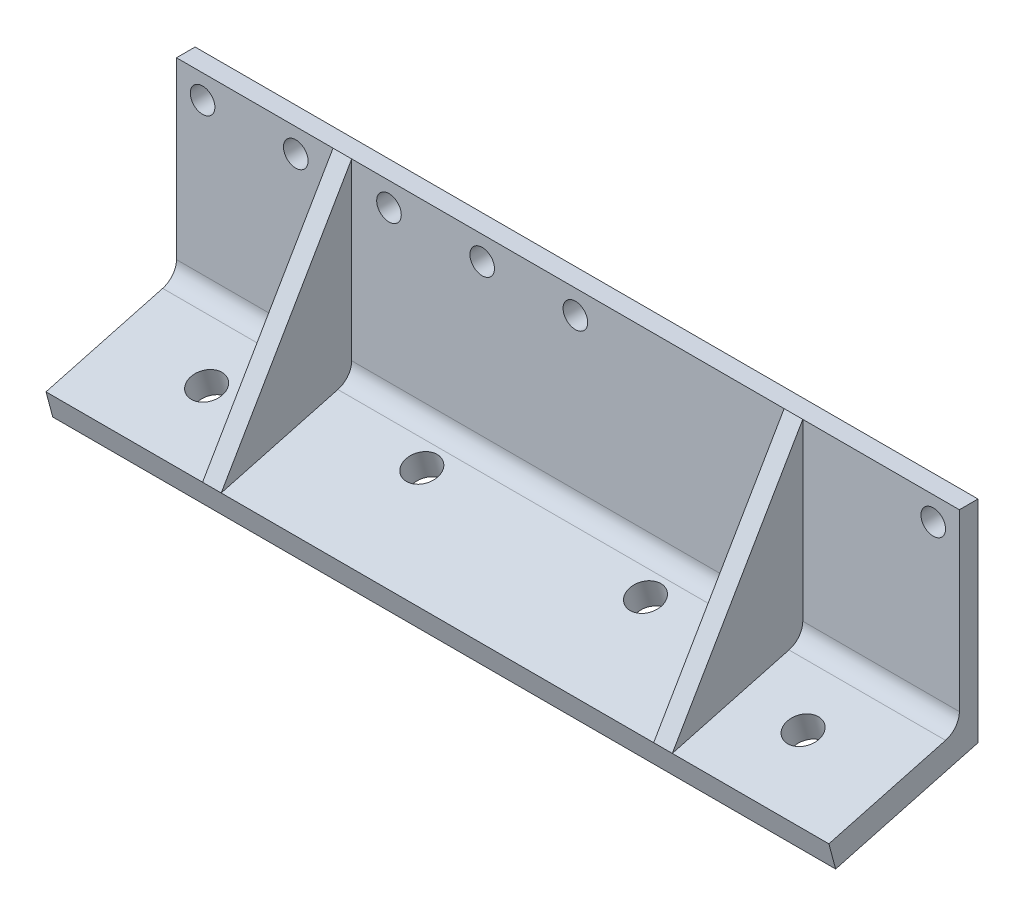
ISO-10303-21;
HEADER;
FILE_DESCRIPTION(('STEP AP214'),'2;1');
FILE_NAME('part.step','',(''),(''),'','','');
FILE_SCHEMA(('AUTOMOTIVE_DESIGN { 1 0 10303 214 1 1 1 1 }'));
ENDSEC;
DATA;
#1=APPLICATION_CONTEXT('core data for automotive mechanical design processes');
#2=APPLICATION_PROTOCOL_DEFINITION('international standard','automotive_design',2000,#1);
#3=PRODUCT_CONTEXT('',#1,'mechanical');
#4=PRODUCT('Part','Part','',(#3));
#5=PRODUCT_RELATED_PRODUCT_CATEGORY('part','',(#4));
#6=PRODUCT_DEFINITION_FORMATION('','',#4);
#7=PRODUCT_DEFINITION_CONTEXT('part definition',#1,'design');
#8=PRODUCT_DEFINITION('design','',#6,#7);
#9=PRODUCT_DEFINITION_SHAPE('','',#8);
#10=(LENGTH_UNIT() NAMED_UNIT(*) SI_UNIT(.MILLI.,.METRE.));
#11=(NAMED_UNIT(*) PLANE_ANGLE_UNIT() SI_UNIT($,.RADIAN.));
#12=(NAMED_UNIT(*) SI_UNIT($,.STERADIAN.) SOLID_ANGLE_UNIT());
#13=UNCERTAINTY_MEASURE_WITH_UNIT(LENGTH_MEASURE(1.E-05),#10,'distance_accuracy_value','');
#14=(GEOMETRIC_REPRESENTATION_CONTEXT(3) GLOBAL_UNCERTAINTY_ASSIGNED_CONTEXT((#13)) GLOBAL_UNIT_ASSIGNED_CONTEXT((#10,
#11,#12)) REPRESENTATION_CONTEXT('',''));
#15=CARTESIAN_POINT('',(0.,0.,0.));
#16=DIRECTION('',(0.,0.,1.));
#17=DIRECTION('',(1.,0.,0.));
#18=AXIS2_PLACEMENT_3D('',#15,#16,#17);
#19=CARTESIAN_POINT('',(-52.,-241.069901587953,57.));
#20=DIRECTION('',(0.,0.,1.));
#21=DIRECTION('',(1.,0.,0.));
#22=AXIS2_PLACEMENT_3D('',#19,#20,#21);
#23=PLANE('',#22);
#24=CARTESIAN_POINT('',(55.,23.65,57.));
#25=DIRECTION('',(0.,0.,1.));
#26=DIRECTION('',(1.,0.,0.));
#27=AXIS2_PLACEMENT_3D('',#24,#25,#26);
#28=CIRCLE('',#27,3.3);
#29=CARTESIAN_POINT('',(58.3,23.65,57.));
#30=VERTEX_POINT('',#29);
#31=EDGE_CURVE('E428',#30,#30,#28,.T.);
#32=ORIENTED_EDGE('',*,*,#31,.F.);
#33=EDGE_LOOP('',(#32));
#34=FACE_BOUND('',#33,.T.);
#35=CARTESIAN_POINT('',(30.,23.65,57.));
#36=DIRECTION('',(0.,0.,1.));
#37=DIRECTION('',(1.,0.,0.));
#38=AXIS2_PLACEMENT_3D('',#35,#36,#37);
#39=CIRCLE('',#38,3.3);
#40=CARTESIAN_POINT('',(33.3,23.65,57.));
#41=VERTEX_POINT('',#40);
#42=EDGE_CURVE('E422',#41,#41,#39,.T.);
#43=ORIENTED_EDGE('',*,*,#42,.F.);
#44=EDGE_LOOP('',(#43));
#45=FACE_BOUND('',#44,.T.);
#46=CARTESIAN_POINT('',(5.00000000000003,23.65,57.));
#47=DIRECTION('',(0.,0.,1.));
#48=DIRECTION('',(1.,0.,0.));
#49=AXIS2_PLACEMENT_3D('',#46,#47,#48);
#50=CIRCLE('',#49,3.30000000000001);
#51=CARTESIAN_POINT('',(8.30000000000004,23.65,57.));
#52=VERTEX_POINT('',#51);
#53=EDGE_CURVE('E416',#52,#52,#50,.T.);
#54=ORIENTED_EDGE('',*,*,#53,.F.);
#55=EDGE_LOOP('',(#54));
#56=FACE_BOUND('',#55,.T.);
#57=DIRECTION('',(-1.,0.,0.));
#58=VECTOR('',#57,1.);
#59=CARTESIAN_POINT('',(153.,-16.891642309636,57.));
#60=LINE('',#59,#58);
#61=CARTESIAN_POINT('',(-4.99999999999999,-16.891642309636,57.));
#62=VERTEX_POINT('',#61);
#63=CARTESIAN_POINT('',(111.,-16.891642309636,57.));
#64=VERTEX_POINT('',#63);
#65=EDGE_CURVE('E52',#62,#64,#60,.F.);
#66=ORIENTED_EDGE('',*,*,#65,.T.);
#67=DIRECTION('',(0.,1.,0.));
#68=VECTOR('',#67,1.);
#69=CARTESIAN_POINT('',(111.,-16.891642309636,57.));
#70=LINE('',#69,#68);
#71=CARTESIAN_POINT('',(111.,30.,57.));
#72=VERTEX_POINT('',#71);
#73=EDGE_CURVE('E278',#64,#72,#70,.T.);
#74=ORIENTED_EDGE('',*,*,#73,.T.);
#75=DIRECTION('',(1.,0.,0.));
#76=VECTOR('',#75,1.);
#77=CARTESIAN_POINT('',(-52.,30.,57.));
#78=LINE('',#77,#76);
#79=CARTESIAN_POINT('',(-4.99999999999998,30.,57.));
#80=VERTEX_POINT('',#79);
#81=EDGE_CURVE('E68',#80,#72,#78,.T.);
#82=ORIENTED_EDGE('',*,*,#81,.F.);
#83=DIRECTION('',(0.,-1.,0.));
#84=VECTOR('',#83,1.);
#85=CARTESIAN_POINT('',(-4.99999999999999,30.,57.));
#86=LINE('',#85,#84);
#87=EDGE_CURVE('E312',#80,#62,#86,.T.);
#88=ORIENTED_EDGE('',*,*,#87,.T.);
#89=EDGE_LOOP('',(#66,#74,#82,#88));
#90=FACE_BOUND('',#89,.T.);
#91=ADVANCED_FACE('F43',(#34,#45,#56,#90),#23,.T.);
#92=CARTESIAN_POINT('',(196.54205491934,-30.10649898462,92.));
#93=DIRECTION('',(0.,0.965925826289069,0.258819045102519));
#94=DIRECTION('',(0.,-0.258819045102519,0.965925826289069));
#95=AXIS2_PLACEMENT_3D('',#92,#93,#94);
#96=PLANE('',#95);
#97=CARTESIAN_POINT('',(23.,-23.1905949207632,66.1894946534139));
#98=DIRECTION('',(0.,0.965925826289069,0.258819045102519));
#99=DIRECTION('',(0.,-0.258819045102519,0.965925826289069));
#100=AXIS2_PLACEMENT_3D('',#97,#98,#99);
#101=CIRCLE('',#100,4.25);
#102=CARTESIAN_POINT('',(23.,-24.2905758624489,70.2946794151424));
#103=VERTEX_POINT('',#102);
#104=EDGE_CURVE('E333',#103,#103,#101,.T.);
#105=ORIENTED_EDGE('',*,*,#104,.F.);
#106=EDGE_LOOP('',(#105));
#107=FACE_BOUND('',#106,.T.);
#108=CARTESIAN_POINT('',(83.,-23.1905949207632,66.1894946534139));
#109=DIRECTION('',(0.,0.965925826289069,0.258819045102519));
#110=DIRECTION('',(0.,-0.258819045102519,0.965925826289069));
#111=AXIS2_PLACEMENT_3D('',#108,#109,#110);
#112=CIRCLE('',#111,4.25);
#113=CARTESIAN_POINT('',(83.,-24.2905758624489,70.2946794151424));
#114=VERTEX_POINT('',#113);
#115=EDGE_CURVE('E337',#114,#114,#112,.T.);
#116=ORIENTED_EDGE('',*,*,#115,.F.);
#117=EDGE_LOOP('',(#116));
#118=FACE_BOUND('',#117,.T.);
#119=DIRECTION('',(-1.,0.,0.));
#120=VECTOR('',#119,1.);
#121=CARTESIAN_POINT('',(196.54205491934,-30.10649898462,92.));
#122=LINE('',#121,#120);
#123=CARTESIAN_POINT('',(111.,-30.10649898462,92.));
#124=VERTEX_POINT('',#123);
#125=CARTESIAN_POINT('',(-4.99999999999992,-30.10649898462,92.));
#126=VERTEX_POINT('',#125);
#127=EDGE_CURVE('E211',#124,#126,#122,.T.);
#128=ORIENTED_EDGE('',*,*,#127,.F.);
#129=DIRECTION('',(0.,0.258819045102519,-0.965925826289069));
#130=VECTOR('',#129,1.);
#131=CARTESIAN_POINT('',(111.,-30.10649898462,92.));
#132=LINE('',#131,#130);
#133=CARTESIAN_POINT('',(111.,-21.7212714410813,60.7059047744874));
#134=VERTEX_POINT('',#133);
#135=EDGE_CURVE('E285',#124,#134,#132,.T.);
#136=ORIENTED_EDGE('',*,*,#135,.T.);
#137=DIRECTION('',(-1.,0.,0.));
#138=VECTOR('',#137,1.);
#139=CARTESIAN_POINT('',(-47.,-21.7212714410813,60.7059047744874));
#140=LINE('',#139,#138);
#141=CARTESIAN_POINT('',(-4.99999999999998,-21.7212714410813,60.7059047744874));
#142=VERTEX_POINT('',#141);
#143=EDGE_CURVE('E237',#134,#142,#140,.T.);
#144=ORIENTED_EDGE('',*,*,#143,.T.);
#145=DIRECTION('',(0.,-0.258819045102519,0.965925826289069));
#146=VECTOR('',#145,1.);
#147=CARTESIAN_POINT('',(-4.99999999999999,-21.7212714410813,60.7059047744874));
#148=LINE('',#147,#146);
#149=EDGE_CURVE('E303',#142,#126,#148,.T.);
#150=ORIENTED_EDGE('',*,*,#149,.T.);
#151=EDGE_LOOP('',(#128,#136,#144,#150));
#152=FACE_BOUND('',#151,.T.);
#153=ADVANCED_FACE('F399',(#107,#118,#152),#96,.T.);
#154=CARTESIAN_POINT('',(196.54205491934,-16.891642309636,62.));
#155=DIRECTION('',(1.,0.,0.));
#156=DIRECTION('',(0.,0.,-1.));
#157=AXIS2_PLACEMENT_3D('',#154,#155,#156);
#158=CYLINDRICAL_SURFACE('',#157,5.);
#159=CARTESIAN_POINT('',(111.,-16.891642309636,62.));
#160=DIRECTION('',(1.,0.,0.));
#161=DIRECTION('',(0.,0.,-1.));
#162=AXIS2_PLACEMENT_3D('',#159,#160,#161);
#163=CIRCLE('',#162,5.);
#164=EDGE_CURVE('E288',#134,#64,#163,.T.);
#165=ORIENTED_EDGE('',*,*,#164,.T.);
#166=ORIENTED_EDGE('',*,*,#65,.F.);
#167=CARTESIAN_POINT('',(-4.99999999999999,-16.891642309636,62.));
#168=DIRECTION('',(-1.,0.,0.));
#169=DIRECTION('',(0.,0.,1.));
#170=AXIS2_PLACEMENT_3D('',#167,#168,#169);
#171=CIRCLE('',#170,5.);
#172=EDGE_CURVE('E314',#62,#142,#171,.T.);
#173=ORIENTED_EDGE('',*,*,#172,.T.);
#174=ORIENTED_EDGE('',*,*,#143,.F.);
#175=EDGE_LOOP('',(#165,#166,#173,#174));
#176=FACE_BOUND('',#175,.T.);
#177=ADVANCED_FACE('F394',(#176),#158,.F.);
#178=CARTESIAN_POINT('',(151.,23.65,57.));
#179=DIRECTION('',(0.,0.,1.));
#180=DIRECTION('',(1.,0.,0.));
#181=AXIS2_PLACEMENT_3D('',#178,#179,#180);
#182=CIRCLE('',#181,3.3);
#183=CARTESIAN_POINT('',(154.3,23.65,57.));
#184=VERTEX_POINT('',#183);
#185=EDGE_CURVE('E434',#184,#184,#182,.T.);
#186=ORIENTED_EDGE('',*,*,#185,.F.);
#187=EDGE_LOOP('',(#186));
#188=FACE_BOUND('',#187,.T.);
#189=DIRECTION('',(0.,1.,0.));
#190=VECTOR('',#189,1.);
#191=CARTESIAN_POINT('',(116.,-16.891642309636,57.));
#192=LINE('',#191,#190);
#193=CARTESIAN_POINT('',(116.,-16.891642309636,57.));
#194=VERTEX_POINT('',#193);
#195=CARTESIAN_POINT('',(116.,30.,57.));
#196=VERTEX_POINT('',#195);
#197=EDGE_CURVE('E282',#194,#196,#192,.T.);
#198=ORIENTED_EDGE('',*,*,#197,.F.);
#199=CARTESIAN_POINT('',(158.,-16.891642309636,57.));
#200=VERTEX_POINT('',#199);
#201=EDGE_CURVE('E53',#194,#200,#60,.F.);
#202=ORIENTED_EDGE('',*,*,#201,.T.);
#203=DIRECTION('',(0.,-1.,0.));
#204=VECTOR('',#203,1.);
#205=CARTESIAN_POINT('',(158.,30.,57.));
#206=LINE('',#205,#204);
#207=CARTESIAN_POINT('',(158.,30.,57.));
#208=VERTEX_POINT('',#207);
#209=EDGE_CURVE('E154',#208,#200,#206,.T.);
#210=ORIENTED_EDGE('',*,*,#209,.F.);
#211=DIRECTION('',(1.,0.,0.));
#212=VECTOR('',#211,1.);
#213=CARTESIAN_POINT('',(153.,30.,57.));
#214=LINE('',#213,#212);
#215=EDGE_CURVE('E159',#196,#208,#214,.T.);
#216=ORIENTED_EDGE('',*,*,#215,.F.);
#217=EDGE_LOOP('',(#198,#202,#210,#216));
#218=FACE_BOUND('',#217,.T.);
#219=ADVANCED_FACE('F157',(#188,#218),#23,.T.);
#220=DIRECTION('',(0.,0.258819045102519,-0.965925826289069));
#221=VECTOR('',#220,1.);
#222=CARTESIAN_POINT('',(116.,-30.10649898462,92.));
#223=LINE('',#222,#221);
#224=CARTESIAN_POINT('',(116.,-30.10649898462,92.));
#225=VERTEX_POINT('',#224);
#226=CARTESIAN_POINT('',(116.,-21.7212714410813,60.7059047744874));
#227=VERTEX_POINT('',#226);
#228=EDGE_CURVE('E277',#225,#227,#223,.T.);
#229=ORIENTED_EDGE('',*,*,#228,.F.);
#230=CARTESIAN_POINT('',(158.,-30.10649898462,92.));
#231=VERTEX_POINT('',#230);
#232=EDGE_CURVE('E205',#231,#225,#122,.T.);
#233=ORIENTED_EDGE('',*,*,#232,.F.);
#234=DIRECTION('',(0.,-0.258819045102519,0.965925826289069));
#235=VECTOR('',#234,1.);
#236=CARTESIAN_POINT('',(158.,-21.7212714410813,60.7059047744874));
#237=LINE('',#236,#235);
#238=CARTESIAN_POINT('',(158.,-21.7212714410813,60.7059047744874));
#239=VERTEX_POINT('',#238);
#240=EDGE_CURVE('E267',#239,#231,#237,.T.);
#241=ORIENTED_EDGE('',*,*,#240,.F.);
#242=EDGE_CURVE('E234',#239,#227,#140,.T.);
#243=ORIENTED_EDGE('',*,*,#242,.T.);
#244=EDGE_LOOP('',(#229,#233,#241,#243));
#245=FACE_BOUND('',#244,.T.);
#246=CARTESIAN_POINT('',(133.,-25.2611472815833,73.9169012637264));
#247=DIRECTION('',(0.,0.965925826289069,0.258819045102519));
#248=DIRECTION('',(0.,-0.258819045102519,0.965925826289069));
#249=AXIS2_PLACEMENT_3D('',#246,#247,#248);
#250=CIRCLE('',#249,4.25);
#251=CARTESIAN_POINT('',(133.,-26.361128223269,78.022086025455));
#252=VERTEX_POINT('',#251);
#253=EDGE_CURVE('E327',#252,#252,#250,.T.);
#254=ORIENTED_EDGE('',*,*,#253,.F.);
#255=EDGE_LOOP('',(#254));
#256=FACE_BOUND('',#255,.T.);
#257=ADVANCED_FACE('F402',(#245,#256),#96,.T.);
#258=ORIENTED_EDGE('',*,*,#201,.F.);
#259=CARTESIAN_POINT('',(116.,-16.891642309636,62.));
#260=DIRECTION('',(1.,0.,0.));
#261=DIRECTION('',(0.,0.,-1.));
#262=AXIS2_PLACEMENT_3D('',#259,#260,#261);
#263=CIRCLE('',#262,5.);
#264=EDGE_CURVE('E280',#227,#194,#263,.T.);
#265=ORIENTED_EDGE('',*,*,#264,.F.);
#266=ORIENTED_EDGE('',*,*,#242,.F.);
#267=CARTESIAN_POINT('',(158.,-16.891642309636,62.));
#268=DIRECTION('',(-1.,0.,0.));
#269=DIRECTION('',(0.,0.,1.));
#270=AXIS2_PLACEMENT_3D('',#267,#268,#269);
#271=CIRCLE('',#270,5.);
#272=EDGE_CURVE('E165',#200,#239,#271,.T.);
#273=ORIENTED_EDGE('',*,*,#272,.F.);
#274=EDGE_LOOP('',(#258,#265,#266,#273));
#275=FACE_BOUND('',#274,.T.);
#276=ADVANCED_FACE('F408',(#275),#158,.F.);
#277=CARTESIAN_POINT('',(160.,30.,-31.93));
#278=DIRECTION('',(0.,1.,0.));
#279=DIRECTION('',(0.,0.,1.));
#280=AXIS2_PLACEMENT_3D('',#277,#278,#279);
#281=PLANE('',#280);
#282=DIRECTION('',(1.,0.,0.));
#283=VECTOR('',#282,1.);
#284=CARTESIAN_POINT('',(160.,30.,52.));
#285=LINE('',#284,#283);
#286=CARTESIAN_POINT('',(-52.,30.,52.));
#287=VERTEX_POINT('',#286);
#288=CARTESIAN_POINT('',(158.,30.,52.));
#289=VERTEX_POINT('',#288);
#290=EDGE_CURVE('E325',#287,#289,#285,.T.);
#291=ORIENTED_EDGE('',*,*,#290,.F.);
#292=DIRECTION('',(0.,0.,1.));
#293=VECTOR('',#292,1.);
#294=CARTESIAN_POINT('',(-52.,30.,0.));
#295=LINE('',#294,#293);
#296=CARTESIAN_POINT('',(-52.,30.,57.));
#297=VERTEX_POINT('',#296);
#298=EDGE_CURVE('E179',#287,#297,#295,.T.);
#299=ORIENTED_EDGE('',*,*,#298,.T.);
#300=CARTESIAN_POINT('',(-9.99999999999998,30.,57.));
#301=VERTEX_POINT('',#300);
#302=EDGE_CURVE('E215',#297,#301,#78,.T.);
#303=ORIENTED_EDGE('',*,*,#302,.T.);
#304=DIRECTION('',(1.,0.,0.));
#305=VECTOR('',#304,1.);
#306=CARTESIAN_POINT('',(-9.99999999999998,30.,57.));
#307=LINE('',#306,#305);
#308=EDGE_CURVE('E322',#301,#80,#307,.T.);
#309=ORIENTED_EDGE('',*,*,#308,.T.);
#310=ORIENTED_EDGE('',*,*,#81,.T.);
#311=DIRECTION('',(-1.,0.,0.));
#312=VECTOR('',#311,1.);
#313=CARTESIAN_POINT('',(116.,30.,57.));
#314=LINE('',#313,#312);
#315=EDGE_CURVE('E183',#196,#72,#314,.T.);
#316=ORIENTED_EDGE('',*,*,#315,.F.);
#317=ORIENTED_EDGE('',*,*,#215,.T.);
#318=DIRECTION('',(0.,0.,1.));
#319=VECTOR('',#318,1.);
#320=CARTESIAN_POINT('',(158.,30.,0.));
#321=LINE('',#320,#319);
#322=EDGE_CURVE('E169',#289,#208,#321,.T.);
#323=ORIENTED_EDGE('',*,*,#322,.F.);
#324=EDGE_LOOP('',(#291,#299,#303,#309,#310,#316,#317,#323));
#325=FACE_BOUND('',#324,.T.);
#326=ADVANCED_FACE('F182',(#325),#281,.T.);
#327=CARTESIAN_POINT('',(158.,0.,0.));
#328=DIRECTION('',(-1.,0.,0.));
#329=DIRECTION('',(0.,0.,1.));
#330=AXIS2_PLACEMENT_3D('',#327,#328,#329);
#331=PLANE('',#330);
#332=ORIENTED_EDGE('',*,*,#272,.T.);
#333=ORIENTED_EDGE('',*,*,#240,.T.);
#334=DIRECTION('',(0.,-0.965925826289069,-0.258819045102518));
#335=VECTOR('',#334,1.);
#336=CARTESIAN_POINT('',(158.,-36.8679797686435,90.1882666842824));
#337=LINE('',#336,#335);
#338=CARTESIAN_POINT('',(158.,-36.8679797686435,90.1882666842824));
#339=VERTEX_POINT('',#338);
#340=EDGE_CURVE('E201',#231,#339,#337,.T.);
#341=ORIENTED_EDGE('',*,*,#340,.T.);
#342=DIRECTION('',(0.,0.258819045102521,-0.965925826289068));
#343=VECTOR('',#342,1.);
#344=CARTESIAN_POINT('',(158.,-40.9998481086648,105.608609259427));
#345=LINE('',#344,#343);
#346=CARTESIAN_POINT('',(158.,-26.6354645502457,52.));
#347=VERTEX_POINT('',#346);
#348=EDGE_CURVE('E217',#339,#347,#345,.T.);
#349=ORIENTED_EDGE('',*,*,#348,.T.);
#350=DIRECTION('',(0.,1.,0.));
#351=VECTOR('',#350,1.);
#352=CARTESIAN_POINT('',(158.,-241.069901587953,52.));
#353=LINE('',#352,#351);
#354=EDGE_CURVE('E173',#347,#289,#353,.T.);
#355=ORIENTED_EDGE('',*,*,#354,.T.);
#356=ORIENTED_EDGE('',*,*,#322,.T.);
#357=ORIENTED_EDGE('',*,*,#209,.T.);
#358=EDGE_LOOP('',(#332,#333,#341,#349,#355,#356,#357));
#359=FACE_BOUND('',#358,.T.);
#360=ADVANCED_FACE('F170',(#359),#331,.F.);
#361=CARTESIAN_POINT('',(-52.,0.,0.));
#362=DIRECTION('',(-1.,0.,0.));
#363=DIRECTION('',(0.,0.,1.));
#364=AXIS2_PLACEMENT_3D('',#361,#362,#363);
#365=PLANE('',#364);
#366=DIRECTION('',(0.,1.,0.));
#367=VECTOR('',#366,1.);
#368=CARTESIAN_POINT('',(-52.,-16.891642309636,57.));
#369=LINE('',#368,#367);
#370=CARTESIAN_POINT('',(-52.,-16.891642309636,57.));
#371=VERTEX_POINT('',#370);
#372=EDGE_CURVE('E263',#371,#297,#369,.T.);
#373=ORIENTED_EDGE('',*,*,#372,.T.);
#374=ORIENTED_EDGE('',*,*,#298,.F.);
#375=DIRECTION('',(0.,1.,0.));
#376=VECTOR('',#375,1.);
#377=CARTESIAN_POINT('',(-52.,-241.069901587953,52.));
#378=LINE('',#377,#376);
#379=CARTESIAN_POINT('',(-52.,-26.6354645502457,52.));
#380=VERTEX_POINT('',#379);
#381=EDGE_CURVE('E221',#380,#287,#378,.T.);
#382=ORIENTED_EDGE('',*,*,#381,.F.);
#383=DIRECTION('',(0.,-0.258819045102521,0.965925826289068));
#384=VECTOR('',#383,1.);
#385=CARTESIAN_POINT('',(-51.9999999999999,-40.9998481086648,105.608609259427));
#386=LINE('',#385,#384);
#387=CARTESIAN_POINT('',(-52.,-36.8679797686435,90.1882666842824));
#388=VERTEX_POINT('',#387);
#389=EDGE_CURVE('E218',#380,#388,#386,.T.);
#390=ORIENTED_EDGE('',*,*,#389,.T.);
#391=DIRECTION('',(0.,0.965925826289069,0.258819045102519));
#392=VECTOR('',#391,1.);
#393=CARTESIAN_POINT('',(-52.,-36.8679797686435,90.1882666842824));
#394=LINE('',#393,#392);
#395=CARTESIAN_POINT('',(-52.,-30.10649898462,92.));
#396=VERTEX_POINT('',#395);
#397=EDGE_CURVE('E193',#388,#396,#394,.T.);
#398=ORIENTED_EDGE('',*,*,#397,.T.);
#399=DIRECTION('',(0.,0.258819045102519,-0.965925826289069));
#400=VECTOR('',#399,1.);
#401=CARTESIAN_POINT('',(-52.,-30.10649898462,92.));
#402=LINE('',#401,#400);
#403=CARTESIAN_POINT('',(-52.,-21.7212714410813,60.7059047744874));
#404=VERTEX_POINT('',#403);
#405=EDGE_CURVE('E253',#396,#404,#402,.T.);
#406=ORIENTED_EDGE('',*,*,#405,.T.);
#407=CARTESIAN_POINT('',(-52.,-16.891642309636,62.));
#408=DIRECTION('',(1.,0.,0.));
#409=DIRECTION('',(0.,0.,-1.));
#410=AXIS2_PLACEMENT_3D('',#407,#408,#409);
#411=CIRCLE('',#410,5.);
#412=EDGE_CURVE('E259',#404,#371,#411,.T.);
#413=ORIENTED_EDGE('',*,*,#412,.T.);
#414=EDGE_LOOP('',(#373,#374,#382,#390,#398,#406,#413));
#415=FACE_BOUND('',#414,.T.);
#416=ADVANCED_FACE('F265',(#415),#365,.T.);
#417=CARTESIAN_POINT('',(-52.,-241.069901587953,52.));
#418=DIRECTION('',(0.,0.,-1.));
#419=DIRECTION('',(-1.,0.,0.));
#420=AXIS2_PLACEMENT_3D('',#417,#418,#419);
#421=PLANE('',#420);
#422=CARTESIAN_POINT('',(-45.,23.65,52.));
#423=DIRECTION('',(0.,0.,1.));
#424=DIRECTION('',(1.,0.,0.));
#425=AXIS2_PLACEMENT_3D('',#422,#423,#424);
#426=CIRCLE('',#425,3.3);
#427=CARTESIAN_POINT('',(-41.7,23.65,52.));
#428=VERTEX_POINT('',#427);
#429=EDGE_CURVE('E166',#428,#428,#426,.T.);
#430=ORIENTED_EDGE('',*,*,#429,.T.);
#431=EDGE_LOOP('',(#430));
#432=FACE_BOUND('',#431,.T.);
#433=CARTESIAN_POINT('',(151.,23.65,52.));
#434=DIRECTION('',(0.,0.,1.));
#435=DIRECTION('',(1.,0.,0.));
#436=AXIS2_PLACEMENT_3D('',#433,#434,#435);
#437=CIRCLE('',#436,3.3);
#438=CARTESIAN_POINT('',(154.3,23.65,52.));
#439=VERTEX_POINT('',#438);
#440=EDGE_CURVE('E437',#439,#439,#437,.T.);
#441=ORIENTED_EDGE('',*,*,#440,.T.);
#442=EDGE_LOOP('',(#441));
#443=FACE_BOUND('',#442,.T.);
#444=CARTESIAN_POINT('',(55.,23.65,52.));
#445=DIRECTION('',(0.,0.,1.));
#446=DIRECTION('',(1.,0.,0.));
#447=AXIS2_PLACEMENT_3D('',#444,#445,#446);
#448=CIRCLE('',#447,3.3);
#449=CARTESIAN_POINT('',(58.3,23.65,52.));
#450=VERTEX_POINT('',#449);
#451=EDGE_CURVE('E431',#450,#450,#448,.T.);
#452=ORIENTED_EDGE('',*,*,#451,.T.);
#453=EDGE_LOOP('',(#452));
#454=FACE_BOUND('',#453,.T.);
#455=CARTESIAN_POINT('',(30.,23.65,52.));
#456=DIRECTION('',(0.,0.,1.));
#457=DIRECTION('',(1.,0.,0.));
#458=AXIS2_PLACEMENT_3D('',#455,#456,#457);
#459=CIRCLE('',#458,3.3);
#460=CARTESIAN_POINT('',(33.3,23.65,52.));
#461=VERTEX_POINT('',#460);
#462=EDGE_CURVE('E425',#461,#461,#459,.T.);
#463=ORIENTED_EDGE('',*,*,#462,.T.);
#464=EDGE_LOOP('',(#463));
#465=FACE_BOUND('',#464,.T.);
#466=CARTESIAN_POINT('',(5.00000000000003,23.65,52.));
#467=DIRECTION('',(0.,0.,1.));
#468=DIRECTION('',(1.,0.,0.));
#469=AXIS2_PLACEMENT_3D('',#466,#467,#468);
#470=CIRCLE('',#469,3.30000000000001);
#471=CARTESIAN_POINT('',(8.30000000000004,23.65,52.));
#472=VERTEX_POINT('',#471);
#473=EDGE_CURVE('E419',#472,#472,#470,.T.);
#474=ORIENTED_EDGE('',*,*,#473,.T.);
#475=EDGE_LOOP('',(#474));
#476=FACE_BOUND('',#475,.T.);
#477=CARTESIAN_POINT('',(-20.,23.65,52.));
#478=DIRECTION('',(0.,0.,1.));
#479=DIRECTION('',(1.,0.,0.));
#480=AXIS2_PLACEMENT_3D('',#477,#478,#479);
#481=CIRCLE('',#480,3.3);
#482=CARTESIAN_POINT('',(-16.7,23.65,52.));
#483=VERTEX_POINT('',#482);
#484=EDGE_CURVE('E413',#483,#483,#481,.T.);
#485=ORIENTED_EDGE('',*,*,#484,.T.);
#486=EDGE_LOOP('',(#485));
#487=FACE_BOUND('',#486,.T.);
#488=ORIENTED_EDGE('',*,*,#381,.T.);
#489=ORIENTED_EDGE('',*,*,#290,.T.);
#490=ORIENTED_EDGE('',*,*,#354,.F.);
#491=DIRECTION('',(-1.,0.,0.));
#492=VECTOR('',#491,1.);
#493=CARTESIAN_POINT('',(-52.,-26.6354645502457,52.));
#494=LINE('',#493,#492);
#495=EDGE_CURVE('E222',#347,#380,#494,.T.);
#496=ORIENTED_EDGE('',*,*,#495,.T.);
#497=EDGE_LOOP('',(#488,#489,#490,#496));
#498=FACE_BOUND('',#497,.T.);
#499=ADVANCED_FACE('F361',(#432,#443,#454,#465,#476,#487,#498),#421,.T.);
#500=CARTESIAN_POINT('',(0.,-11.8512267461792,-3.17552663595684));
#501=DIRECTION('',(0.,-0.965925826289068,-0.258819045102521));
#502=DIRECTION('',(0.,0.258819045102521,-0.965925826289068));
#503=AXIS2_PLACEMENT_3D('',#500,#501,#502);
#504=PLANE('',#503);
#505=CARTESIAN_POINT('',(-27.,-32.0226280656068,72.1051679480088));
#506=DIRECTION('',(0.,-0.965925826289068,-0.258819045102521));
#507=DIRECTION('',(0.,0.258819045102521,-0.965925826289068));
#508=AXIS2_PLACEMENT_3D('',#505,#506,#507);
#509=CIRCLE('',#508,4.25);
#510=CARTESIAN_POINT('',(-27.,-30.9226471239211,67.9999831862803));
#511=VERTEX_POINT('',#510);
#512=EDGE_CURVE('E186',#511,#511,#509,.T.);
#513=ORIENTED_EDGE('',*,*,#512,.F.);
#514=EDGE_LOOP('',(#513));
#515=FACE_BOUND('',#514,.T.);
#516=CARTESIAN_POINT('',(23.,-29.9520757047866,64.3777613376962));
#517=DIRECTION('',(0.,-0.965925826289068,-0.258819045102521));
#518=DIRECTION('',(0.,0.258819045102521,-0.965925826289068));
#519=AXIS2_PLACEMENT_3D('',#516,#517,#518);
#520=CIRCLE('',#519,4.25);
#521=CARTESIAN_POINT('',(23.,-28.8520947631009,60.2725765759677));
#522=VERTEX_POINT('',#521);
#523=EDGE_CURVE('E197',#522,#522,#520,.T.);
#524=ORIENTED_EDGE('',*,*,#523,.F.);
#525=EDGE_LOOP('',(#524));
#526=FACE_BOUND('',#525,.T.);
#527=CARTESIAN_POINT('',(83.,-29.9520757047866,64.3777613376962));
#528=DIRECTION('',(0.,-0.965925826289068,-0.258819045102521));
#529=DIRECTION('',(0.,0.258819045102521,-0.965925826289068));
#530=AXIS2_PLACEMENT_3D('',#527,#528,#529);
#531=CIRCLE('',#530,4.25);
#532=CARTESIAN_POINT('',(83.,-28.8520947631009,60.2725765759677));
#533=VERTEX_POINT('',#532);
#534=EDGE_CURVE('E347',#533,#533,#531,.T.);
#535=ORIENTED_EDGE('',*,*,#534,.F.);
#536=EDGE_LOOP('',(#535));
#537=FACE_BOUND('',#536,.T.);
#538=CARTESIAN_POINT('',(133.,-32.0226280656068,72.1051679480088));
#539=DIRECTION('',(0.,-0.965925826289068,-0.258819045102521));
#540=DIRECTION('',(0.,0.258819045102521,-0.965925826289068));
#541=AXIS2_PLACEMENT_3D('',#538,#539,#540);
#542=CIRCLE('',#541,4.25);
#543=CARTESIAN_POINT('',(133.,-30.9226471239211,67.9999831862803));
#544=VERTEX_POINT('',#543);
#545=EDGE_CURVE('E332',#544,#544,#542,.T.);
#546=ORIENTED_EDGE('',*,*,#545,.F.);
#547=EDGE_LOOP('',(#546));
#548=FACE_BOUND('',#547,.T.);
#549=ORIENTED_EDGE('',*,*,#389,.F.);
#550=ORIENTED_EDGE('',*,*,#495,.F.);
#551=ORIENTED_EDGE('',*,*,#348,.F.);
#552=DIRECTION('',(-1.,0.,0.));
#553=VECTOR('',#552,1.);
#554=CARTESIAN_POINT('',(196.54205491934,-36.8679797686435,90.1882666842824));
#555=LINE('',#554,#553);
#556=EDGE_CURVE('E209',#339,#388,#555,.T.);
#557=ORIENTED_EDGE('',*,*,#556,.T.);
#558=EDGE_LOOP('',(#549,#550,#551,#557));
#559=FACE_BOUND('',#558,.T.);
#560=ADVANCED_FACE('F357',(#515,#526,#537,#548,#559),#504,.T.);
#561=CARTESIAN_POINT('',(-45.,23.65,57.));
#562=DIRECTION('',(0.,0.,1.));
#563=DIRECTION('',(1.,0.,0.));
#564=AXIS2_PLACEMENT_3D('',#561,#562,#563);
#565=CIRCLE('',#564,3.3);
#566=CARTESIAN_POINT('',(-41.7,23.65,57.));
#567=VERTEX_POINT('',#566);
#568=EDGE_CURVE('E440',#567,#567,#565,.T.);
#569=ORIENTED_EDGE('',*,*,#568,.F.);
#570=EDGE_LOOP('',(#569));
#571=FACE_BOUND('',#570,.T.);
#572=CARTESIAN_POINT('',(-20.,23.65,57.));
#573=DIRECTION('',(0.,0.,1.));
#574=DIRECTION('',(1.,0.,0.));
#575=AXIS2_PLACEMENT_3D('',#572,#573,#574);
#576=CIRCLE('',#575,3.3);
#577=CARTESIAN_POINT('',(-16.7,23.65,57.));
#578=VERTEX_POINT('',#577);
#579=EDGE_CURVE('E410',#578,#578,#576,.T.);
#580=ORIENTED_EDGE('',*,*,#579,.F.);
#581=EDGE_LOOP('',(#580));
#582=FACE_BOUND('',#581,.T.);
#583=DIRECTION('',(0.,-1.,0.));
#584=VECTOR('',#583,1.);
#585=CARTESIAN_POINT('',(-9.99999999999998,30.,57.));
#586=LINE('',#585,#584);
#587=CARTESIAN_POINT('',(-9.99999999999998,-16.891642309636,57.));
#588=VERTEX_POINT('',#587);
#589=EDGE_CURVE('E302',#301,#588,#586,.T.);
#590=ORIENTED_EDGE('',*,*,#589,.F.);
#591=ORIENTED_EDGE('',*,*,#302,.F.);
#592=ORIENTED_EDGE('',*,*,#372,.F.);
#593=EDGE_CURVE('E11',#371,#588,#60,.F.);
#594=ORIENTED_EDGE('',*,*,#593,.T.);
#595=EDGE_LOOP('',(#590,#591,#592,#594));
#596=FACE_BOUND('',#595,.T.);
#597=ADVANCED_FACE('F360',(#571,#582,#596),#23,.T.);
#598=DIRECTION('',(0.,-0.258819045102519,0.965925826289069));
#599=VECTOR('',#598,1.);
#600=CARTESIAN_POINT('',(-9.99999999999998,-21.7212714410813,60.7059047744874));
#601=LINE('',#600,#599);
#602=CARTESIAN_POINT('',(-9.99999999999998,-21.7212714410813,60.7059047744874));
#603=VERTEX_POINT('',#602);
#604=CARTESIAN_POINT('',(-9.99999999999993,-30.10649898462,92.));
#605=VERTEX_POINT('',#604);
#606=EDGE_CURVE('E255',#603,#605,#601,.T.);
#607=ORIENTED_EDGE('',*,*,#606,.F.);
#608=EDGE_CURVE('E178',#603,#404,#140,.T.);
#609=ORIENTED_EDGE('',*,*,#608,.T.);
#610=ORIENTED_EDGE('',*,*,#405,.F.);
#611=DIRECTION('',(-1.,0.,0.));
#612=VECTOR('',#611,1.);
#613=CARTESIAN_POINT('',(-47.,-30.10649898462,92.));
#614=LINE('',#613,#612);
#615=EDGE_CURVE('E185',#605,#396,#614,.T.);
#616=ORIENTED_EDGE('',*,*,#615,.F.);
#617=EDGE_LOOP('',(#607,#609,#610,#616));
#618=FACE_BOUND('',#617,.T.);
#619=CARTESIAN_POINT('',(-27.,-25.2611472815833,73.9169012637264));
#620=DIRECTION('',(0.,0.965925826289069,0.258819045102519));
#621=DIRECTION('',(0.,-0.258819045102519,0.965925826289069));
#622=AXIS2_PLACEMENT_3D('',#619,#620,#621);
#623=CIRCLE('',#622,4.25);
#624=CARTESIAN_POINT('',(-27.,-26.361128223269,78.022086025455));
#625=VERTEX_POINT('',#624);
#626=EDGE_CURVE('E328',#625,#625,#623,.T.);
#627=ORIENTED_EDGE('',*,*,#626,.F.);
#628=EDGE_LOOP('',(#627));
#629=FACE_BOUND('',#628,.T.);
#630=ADVANCED_FACE('F250',(#618,#629),#96,.T.);
#631=CARTESIAN_POINT('',(196.54205491934,-36.8679797686435,90.1882666842824));
#632=DIRECTION('',(0.,-0.258819045102518,0.965925826289069));
#633=DIRECTION('',(0.,-0.965925826289069,-0.258819045102518));
#634=AXIS2_PLACEMENT_3D('',#631,#632,#633);
#635=PLANE('',#634);
#636=ORIENTED_EDGE('',*,*,#340,.F.);
#637=ORIENTED_EDGE('',*,*,#232,.T.);
#638=DIRECTION('',(-1.,0.,0.));
#639=VECTOR('',#638,1.);
#640=CARTESIAN_POINT('',(116.,-30.10649898462,92.));
#641=LINE('',#640,#639);
#642=EDGE_CURVE('E294',#225,#124,#641,.T.);
#643=ORIENTED_EDGE('',*,*,#642,.T.);
#644=ORIENTED_EDGE('',*,*,#127,.T.);
#645=DIRECTION('',(1.,0.,0.));
#646=VECTOR('',#645,1.);
#647=CARTESIAN_POINT('',(-9.99999999999998,-30.10649898462,92.));
#648=LINE('',#647,#646);
#649=EDGE_CURVE('E309',#605,#126,#648,.T.);
#650=ORIENTED_EDGE('',*,*,#649,.F.);
#651=ORIENTED_EDGE('',*,*,#615,.T.);
#652=ORIENTED_EDGE('',*,*,#397,.F.);
#653=ORIENTED_EDGE('',*,*,#556,.F.);
#654=EDGE_LOOP('',(#636,#637,#643,#644,#650,#651,#652,#653));
#655=FACE_BOUND('',#654,.T.);
#656=ADVANCED_FACE('F374',(#655),#635,.T.);
#657=CARTESIAN_POINT('',(133.,-78.3196947366772,59.6999063215657));
#658=DIRECTION('',(0.,0.965925826289069,0.25881904510252));
#659=DIRECTION('',(0.,-0.25881904510252,0.965925826289069));
#660=AXIS2_PLACEMENT_3D('',#657,#658,#659);
#661=CYLINDRICAL_SURFACE('',#660,4.25);
#662=ORIENTED_EDGE('',*,*,#545,.T.);
#663=EDGE_LOOP('',(#662));
#664=FACE_BOUND('',#663,.T.);
#665=ORIENTED_EDGE('',*,*,#253,.T.);
#666=EDGE_LOOP('',(#665));
#667=FACE_BOUND('',#666,.T.);
#668=ADVANCED_FACE('F523',(#664,#667),#661,.F.);
#669=CARTESIAN_POINT('',(83.,-76.249142375857,51.9724997112532));
#670=DIRECTION('',(0.,0.965925826289069,0.25881904510252));
#671=DIRECTION('',(0.,-0.25881904510252,0.965925826289069));
#672=AXIS2_PLACEMENT_3D('',#669,#670,#671);
#673=CYLINDRICAL_SURFACE('',#672,4.25);
#674=ORIENTED_EDGE('',*,*,#534,.T.);
#675=EDGE_LOOP('',(#674));
#676=FACE_BOUND('',#675,.T.);
#677=ORIENTED_EDGE('',*,*,#115,.T.);
#678=EDGE_LOOP('',(#677));
#679=FACE_BOUND('',#678,.T.);
#680=ADVANCED_FACE('F528',(#676,#679),#673,.F.);
#681=CARTESIAN_POINT('',(23.,-76.249142375857,51.9724997112532));
#682=DIRECTION('',(0.,0.965925826289069,0.25881904510252));
#683=DIRECTION('',(0.,-0.25881904510252,0.965925826289069));
#684=AXIS2_PLACEMENT_3D('',#681,#682,#683);
#685=CYLINDRICAL_SURFACE('',#684,4.25);
#686=ORIENTED_EDGE('',*,*,#523,.T.);
#687=EDGE_LOOP('',(#686));
#688=FACE_BOUND('',#687,.T.);
#689=ORIENTED_EDGE('',*,*,#104,.T.);
#690=EDGE_LOOP('',(#689));
#691=FACE_BOUND('',#690,.T.);
#692=ADVANCED_FACE('F354',(#688,#691),#685,.F.);
#693=CARTESIAN_POINT('',(-27.,-78.3196947366772,59.6999063215657));
#694=DIRECTION('',(0.,0.965925826289069,0.25881904510252));
#695=DIRECTION('',(0.,-0.25881904510252,0.965925826289069));
#696=AXIS2_PLACEMENT_3D('',#693,#694,#695);
#697=CYLINDRICAL_SURFACE('',#696,4.25);
#698=ORIENTED_EDGE('',*,*,#512,.T.);
#699=EDGE_LOOP('',(#698));
#700=FACE_BOUND('',#699,.T.);
#701=ORIENTED_EDGE('',*,*,#626,.T.);
#702=EDGE_LOOP('',(#701));
#703=FACE_BOUND('',#702,.T.);
#704=ADVANCED_FACE('F535',(#700,#703),#697,.F.);
#705=ORIENTED_EDGE('',*,*,#608,.F.);
#706=CARTESIAN_POINT('',(-9.99999999999998,-16.891642309636,62.));
#707=DIRECTION('',(-1.,0.,0.));
#708=DIRECTION('',(0.,0.,1.));
#709=AXIS2_PLACEMENT_3D('',#706,#707,#708);
#710=CIRCLE('',#709,5.);
#711=EDGE_CURVE('E306',#588,#603,#710,.T.);
#712=ORIENTED_EDGE('',*,*,#711,.F.);
#713=ORIENTED_EDGE('',*,*,#593,.F.);
#714=ORIENTED_EDGE('',*,*,#412,.F.);
#715=EDGE_LOOP('',(#705,#712,#713,#714));
#716=FACE_BOUND('',#715,.T.);
#717=ADVANCED_FACE('F45',(#716),#158,.F.);
#718=CARTESIAN_POINT('',(-9.99999999999998,-30.10649898462,92.));
#719=DIRECTION('',(0.,-0.503204461916549,-0.864167385121237));
#720=DIRECTION('',(0.,0.864167385121237,-0.503204461916549));
#721=AXIS2_PLACEMENT_3D('',#718,#719,#720);
#722=PLANE('',#721);
#723=DIRECTION('',(0.,0.864167385121237,-0.503204461916549));
#724=VECTOR('',#723,1.);
#725=CARTESIAN_POINT('',(-4.99999999999999,-30.10649898462,92.));
#726=LINE('',#725,#724);
#727=EDGE_CURVE('E298',#126,#80,#726,.T.);
#728=ORIENTED_EDGE('',*,*,#727,.T.);
#729=ORIENTED_EDGE('',*,*,#308,.F.);
#730=DIRECTION('',(0.,0.864167385121237,-0.503204461916549));
#731=VECTOR('',#730,1.);
#732=CARTESIAN_POINT('',(-9.99999999999998,-30.10649898462,92.));
#733=LINE('',#732,#731);
#734=EDGE_CURVE('E299',#605,#301,#733,.T.);
#735=ORIENTED_EDGE('',*,*,#734,.F.);
#736=ORIENTED_EDGE('',*,*,#649,.T.);
#737=EDGE_LOOP('',(#728,#729,#735,#736));
#738=FACE_BOUND('',#737,.T.);
#739=ADVANCED_FACE('F383',(#738),#722,.F.);
#740=CARTESIAN_POINT('',(-9.99999999999998,-16.891642309636,62.));
#741=DIRECTION('',(-1.,0.,0.));
#742=DIRECTION('',(0.,0.,1.));
#743=AXIS2_PLACEMENT_3D('',#740,#741,#742);
#744=PLANE('',#743);
#745=ORIENTED_EDGE('',*,*,#734,.T.);
#746=ORIENTED_EDGE('',*,*,#589,.T.);
#747=ORIENTED_EDGE('',*,*,#711,.T.);
#748=ORIENTED_EDGE('',*,*,#606,.T.);
#749=EDGE_LOOP('',(#745,#746,#747,#748));
#750=FACE_BOUND('',#749,.T.);
#751=ADVANCED_FACE('F381',(#750),#744,.T.);
#752=CARTESIAN_POINT('',(-4.99999999999999,-16.891642309636,62.));
#753=DIRECTION('',(-1.,0.,0.));
#754=DIRECTION('',(0.,0.,1.));
#755=AXIS2_PLACEMENT_3D('',#752,#753,#754);
#756=PLANE('',#755);
#757=ORIENTED_EDGE('',*,*,#727,.F.);
#758=ORIENTED_EDGE('',*,*,#149,.F.);
#759=ORIENTED_EDGE('',*,*,#172,.F.);
#760=ORIENTED_EDGE('',*,*,#87,.F.);
#761=EDGE_LOOP('',(#757,#758,#759,#760));
#762=FACE_BOUND('',#761,.T.);
#763=ADVANCED_FACE('F388',(#762),#756,.F.);
#764=CARTESIAN_POINT('',(116.,30.,57.));
#765=DIRECTION('',(0.,-0.503204461916549,-0.864167385121237));
#766=DIRECTION('',(0.,0.864167385121237,-0.503204461916549));
#767=AXIS2_PLACEMENT_3D('',#764,#765,#766);
#768=PLANE('',#767);
#769=DIRECTION('',(0.,-0.864167385121237,0.503204461916549));
#770=VECTOR('',#769,1.);
#771=CARTESIAN_POINT('',(111.,30.,57.));
#772=LINE('',#771,#770);
#773=EDGE_CURVE('E60',#72,#124,#772,.T.);
#774=ORIENTED_EDGE('',*,*,#773,.T.);
#775=ORIENTED_EDGE('',*,*,#642,.F.);
#776=DIRECTION('',(0.,-0.864167385121237,0.503204461916549));
#777=VECTOR('',#776,1.);
#778=CARTESIAN_POINT('',(116.,30.,57.));
#779=LINE('',#778,#777);
#780=EDGE_CURVE('E274',#196,#225,#779,.T.);
#781=ORIENTED_EDGE('',*,*,#780,.F.);
#782=ORIENTED_EDGE('',*,*,#315,.T.);
#783=EDGE_LOOP('',(#774,#775,#781,#782));
#784=FACE_BOUND('',#783,.T.);
#785=ADVANCED_FACE('F401',(#784),#768,.F.);
#786=CARTESIAN_POINT('',(116.,-16.891642309636,62.));
#787=DIRECTION('',(1.,0.,0.));
#788=DIRECTION('',(0.,0.,-1.));
#789=AXIS2_PLACEMENT_3D('',#786,#787,#788);
#790=PLANE('',#789);
#791=ORIENTED_EDGE('',*,*,#780,.T.);
#792=ORIENTED_EDGE('',*,*,#228,.T.);
#793=ORIENTED_EDGE('',*,*,#264,.T.);
#794=ORIENTED_EDGE('',*,*,#197,.T.);
#795=EDGE_LOOP('',(#791,#792,#793,#794));
#796=FACE_BOUND('',#795,.T.);
#797=ADVANCED_FACE('F406',(#796),#790,.T.);
#798=CARTESIAN_POINT('',(111.,-16.891642309636,62.));
#799=DIRECTION('',(1.,0.,0.));
#800=DIRECTION('',(0.,0.,-1.));
#801=AXIS2_PLACEMENT_3D('',#798,#799,#800);
#802=PLANE('',#801);
#803=ORIENTED_EDGE('',*,*,#773,.F.);
#804=ORIENTED_EDGE('',*,*,#73,.F.);
#805=ORIENTED_EDGE('',*,*,#164,.F.);
#806=ORIENTED_EDGE('',*,*,#135,.F.);
#807=EDGE_LOOP('',(#803,#804,#805,#806));
#808=FACE_BOUND('',#807,.T.);
#809=ADVANCED_FACE('F397',(#808),#802,.F.);
#810=CARTESIAN_POINT('',(-20.,23.65,52.));
#811=DIRECTION('',(0.,0.,1.));
#812=DIRECTION('',(1.,0.,0.));
#813=AXIS2_PLACEMENT_3D('',#810,#811,#812);
#814=CYLINDRICAL_SURFACE('',#813,3.3);
#815=ORIENTED_EDGE('',*,*,#484,.F.);
#816=EDGE_LOOP('',(#815));
#817=FACE_BOUND('',#816,.T.);
#818=ORIENTED_EDGE('',*,*,#579,.T.);
#819=EDGE_LOOP('',(#818));
#820=FACE_BOUND('',#819,.T.);
#821=ADVANCED_FACE('F452',(#817,#820),#814,.F.);
#822=CARTESIAN_POINT('',(-45.,23.65,52.));
#823=DIRECTION('',(0.,0.,1.));
#824=DIRECTION('',(1.,0.,0.));
#825=AXIS2_PLACEMENT_3D('',#822,#823,#824);
#826=CYLINDRICAL_SURFACE('',#825,3.3);
#827=ORIENTED_EDGE('',*,*,#429,.F.);
#828=EDGE_LOOP('',(#827));
#829=FACE_BOUND('',#828,.T.);
#830=ORIENTED_EDGE('',*,*,#568,.T.);
#831=EDGE_LOOP('',(#830));
#832=FACE_BOUND('',#831,.T.);
#833=ADVANCED_FACE('F448',(#829,#832),#826,.F.);
#834=CARTESIAN_POINT('',(5.00000000000003,23.65,52.));
#835=DIRECTION('',(0.,0.,1.));
#836=DIRECTION('',(1.,0.,0.));
#837=AXIS2_PLACEMENT_3D('',#834,#835,#836);
#838=CYLINDRICAL_SURFACE('',#837,3.30000000000001);
#839=ORIENTED_EDGE('',*,*,#473,.F.);
#840=EDGE_LOOP('',(#839));
#841=FACE_BOUND('',#840,.T.);
#842=ORIENTED_EDGE('',*,*,#53,.T.);
#843=EDGE_LOOP('',(#842));
#844=FACE_BOUND('',#843,.T.);
#845=ADVANCED_FACE('F451',(#841,#844),#838,.F.);
#846=CARTESIAN_POINT('',(30.,23.65,52.));
#847=DIRECTION('',(0.,0.,1.));
#848=DIRECTION('',(1.,0.,0.));
#849=AXIS2_PLACEMENT_3D('',#846,#847,#848);
#850=CYLINDRICAL_SURFACE('',#849,3.3);
#851=ORIENTED_EDGE('',*,*,#462,.F.);
#852=EDGE_LOOP('',(#851));
#853=FACE_BOUND('',#852,.T.);
#854=ORIENTED_EDGE('',*,*,#42,.T.);
#855=EDGE_LOOP('',(#854));
#856=FACE_BOUND('',#855,.T.);
#857=ADVANCED_FACE('F499',(#853,#856),#850,.F.);
#858=CARTESIAN_POINT('',(55.,23.65,52.));
#859=DIRECTION('',(0.,0.,1.));
#860=DIRECTION('',(1.,0.,0.));
#861=AXIS2_PLACEMENT_3D('',#858,#859,#860);
#862=CYLINDRICAL_SURFACE('',#861,3.3);
#863=ORIENTED_EDGE('',*,*,#451,.F.);
#864=EDGE_LOOP('',(#863));
#865=FACE_BOUND('',#864,.T.);
#866=ORIENTED_EDGE('',*,*,#31,.T.);
#867=EDGE_LOOP('',(#866));
#868=FACE_BOUND('',#867,.T.);
#869=ADVANCED_FACE('F493',(#865,#868),#862,.F.);
#870=CARTESIAN_POINT('',(151.,23.65,52.));
#871=DIRECTION('',(0.,0.,1.));
#872=DIRECTION('',(1.,0.,0.));
#873=AXIS2_PLACEMENT_3D('',#870,#871,#872);
#874=CYLINDRICAL_SURFACE('',#873,3.3);
#875=ORIENTED_EDGE('',*,*,#440,.F.);
#876=EDGE_LOOP('',(#875));
#877=FACE_BOUND('',#876,.T.);
#878=ORIENTED_EDGE('',*,*,#185,.T.);
#879=EDGE_LOOP('',(#878));
#880=FACE_BOUND('',#879,.T.);
#881=ADVANCED_FACE('F491',(#877,#880),#874,.F.);
#882=CLOSED_SHELL('',(#91,#153,#177,#219,#257,#276,#326,#360,#416,#499,#560,#597,#630,#656,#668,
#680,#692,#704,#717,#739,#751,#763,#785,#797,#809,#821,#833,#845,#857,#869,#881));
#883=MANIFOLD_SOLID_BREP('B2',#882);
#884=ADVANCED_BREP_SHAPE_REPRESENTATION('',(#18,#883),#14);
#885=SHAPE_DEFINITION_REPRESENTATION(#9,#884);
ENDSEC;
END-ISO-10303-21;
